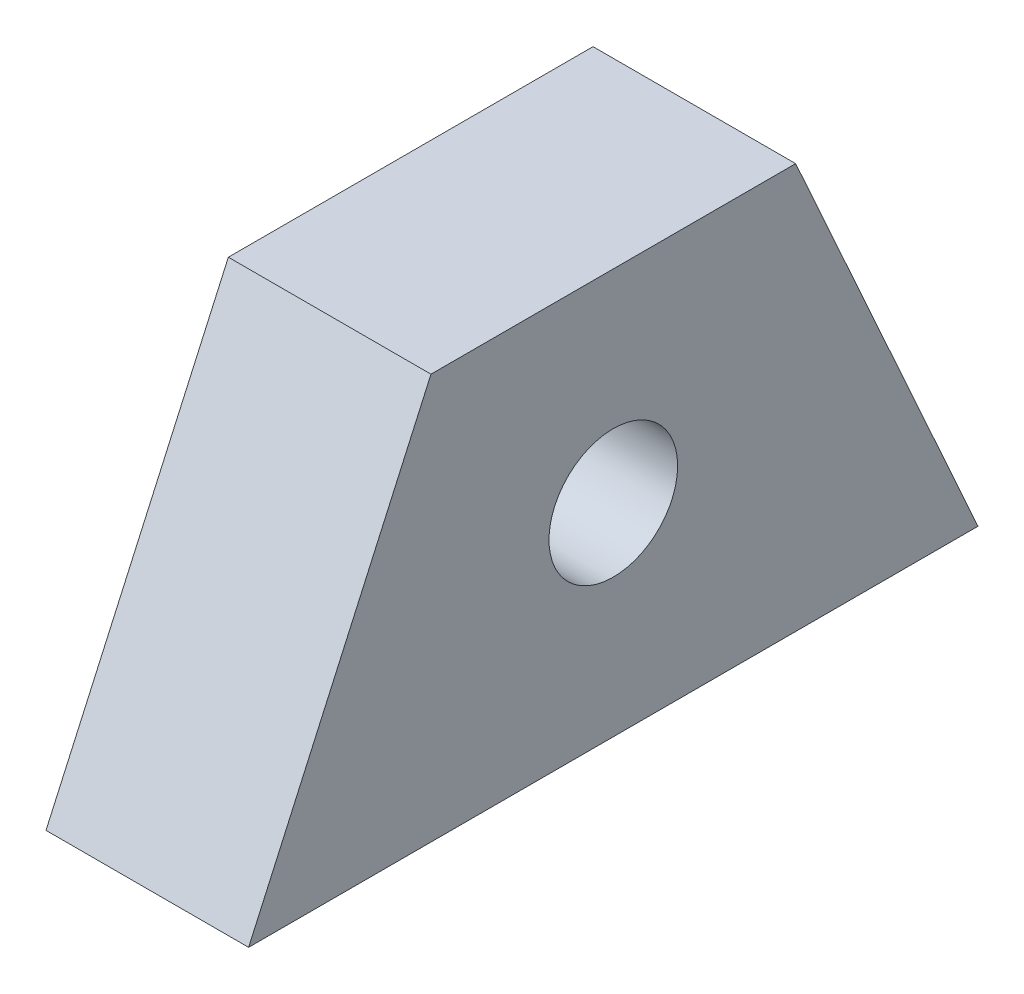
ISO-10303-21;
HEADER;
FILE_DESCRIPTION(('STEP AP214'),'2;1');
FILE_NAME('part.step','',(''),(''),'','','');
FILE_SCHEMA(('AUTOMOTIVE_DESIGN { 1 0 10303 214 1 1 1 1 }'));
ENDSEC;
DATA;
#1=APPLICATION_CONTEXT('core data for automotive mechanical design processes');
#2=APPLICATION_PROTOCOL_DEFINITION('international standard','automotive_design',2000,#1);
#3=PRODUCT_CONTEXT('',#1,'mechanical');
#4=PRODUCT('Part','Part','',(#3));
#5=PRODUCT_RELATED_PRODUCT_CATEGORY('part','',(#4));
#6=PRODUCT_DEFINITION_FORMATION('','',#4);
#7=PRODUCT_DEFINITION_CONTEXT('part definition',#1,'design');
#8=PRODUCT_DEFINITION('design','',#6,#7);
#9=PRODUCT_DEFINITION_SHAPE('','',#8);
#10=(LENGTH_UNIT() NAMED_UNIT(*) SI_UNIT(.MILLI.,.METRE.));
#11=(NAMED_UNIT(*) PLANE_ANGLE_UNIT() SI_UNIT($,.RADIAN.));
#12=(NAMED_UNIT(*) SI_UNIT($,.STERADIAN.) SOLID_ANGLE_UNIT());
#13=UNCERTAINTY_MEASURE_WITH_UNIT(LENGTH_MEASURE(1.E-05),#10,'distance_accuracy_value','');
#14=(GEOMETRIC_REPRESENTATION_CONTEXT(3) GLOBAL_UNCERTAINTY_ASSIGNED_CONTEXT((#13)) GLOBAL_UNIT_ASSIGNED_CONTEXT((#10,
#11,#12)) REPRESENTATION_CONTEXT('',''));
#15=CARTESIAN_POINT('',(0.,0.,0.));
#16=DIRECTION('',(0.,0.,1.));
#17=DIRECTION('',(1.,0.,0.));
#18=AXIS2_PLACEMENT_3D('',#15,#16,#17);
#19=CARTESIAN_POINT('',(10.,6.73596673596674,14.968814968815));
#20=DIRECTION('',(0.,0.410364677328798,0.911921505175106));
#21=DIRECTION('',(0.,-0.911921505175106,0.410364677328798));
#22=AXIS2_PLACEMENT_3D('',#19,#20,#21);
#23=PLANE('',#22);
#24=DIRECTION('',(0.,0.911921505175106,-0.410364677328798));
#25=VECTOR('',#24,1.);
#26=CARTESIAN_POINT('',(0.,6.73596673596674,14.968814968815));
#27=LINE('',#26,#25);
#28=CARTESIAN_POINT('',(0.,0.,18.));
#29=VERTEX_POINT('',#28);
#30=CARTESIAN_POINT('',(0.,20.,9.));
#31=VERTEX_POINT('',#30);
#32=EDGE_CURVE('E110',#29,#31,#27,.T.);
#33=ORIENTED_EDGE('',*,*,#32,.F.);
#34=DIRECTION('',(-1.,0.,0.));
#35=VECTOR('',#34,1.);
#36=CARTESIAN_POINT('',(10.,0.,18.));
#37=LINE('',#36,#35);
#38=CARTESIAN_POINT('',(10.,0.,18.));
#39=VERTEX_POINT('',#38);
#40=EDGE_CURVE('E11',#39,#29,#37,.T.);
#41=ORIENTED_EDGE('',*,*,#40,.F.);
#42=DIRECTION('',(0.,0.911921505175106,-0.410364677328798));
#43=VECTOR('',#42,1.);
#44=CARTESIAN_POINT('',(10.,6.73596673596674,14.968814968815));
#45=LINE('',#44,#43);
#46=CARTESIAN_POINT('',(10.,20.,9.));
#47=VERTEX_POINT('',#46);
#48=EDGE_CURVE('E95',#39,#47,#45,.T.);
#49=ORIENTED_EDGE('',*,*,#48,.T.);
#50=DIRECTION('',(-1.,0.,0.));
#51=VECTOR('',#50,1.);
#52=CARTESIAN_POINT('',(10.,20.,9.));
#53=LINE('',#52,#51);
#54=EDGE_CURVE('E83',#47,#31,#53,.T.);
#55=ORIENTED_EDGE('',*,*,#54,.T.);
#56=EDGE_LOOP('',(#33,#41,#49,#55));
#57=FACE_BOUND('',#56,.T.);
#58=ADVANCED_FACE('F44',(#57),#23,.T.);
#59=CARTESIAN_POINT('',(10.,0.,0.));
#60=DIRECTION('',(0.,1.,0.));
#61=DIRECTION('',(0.,0.,1.));
#62=AXIS2_PLACEMENT_3D('',#59,#60,#61);
#63=PLANE('',#62);
#64=DIRECTION('',(0.,0.,-1.));
#65=VECTOR('',#64,1.);
#66=CARTESIAN_POINT('',(0.,0.,0.));
#67=LINE('',#66,#65);
#68=CARTESIAN_POINT('',(0.,0.,-18.));
#69=VERTEX_POINT('',#68);
#70=EDGE_CURVE('E100',#29,#69,#67,.T.);
#71=ORIENTED_EDGE('',*,*,#70,.T.);
#72=DIRECTION('',(-1.,0.,0.));
#73=VECTOR('',#72,1.);
#74=CARTESIAN_POINT('',(10.,0.,-18.));
#75=LINE('',#74,#73);
#76=CARTESIAN_POINT('',(10.,0.,-18.));
#77=VERTEX_POINT('',#76);
#78=EDGE_CURVE('E52',#77,#69,#75,.T.);
#79=ORIENTED_EDGE('',*,*,#78,.F.);
#80=DIRECTION('',(0.,0.,-1.));
#81=VECTOR('',#80,1.);
#82=CARTESIAN_POINT('',(10.,0.,0.));
#83=LINE('',#82,#81);
#84=EDGE_CURVE('E89',#39,#77,#83,.T.);
#85=ORIENTED_EDGE('',*,*,#84,.F.);
#86=ORIENTED_EDGE('',*,*,#40,.T.);
#87=EDGE_LOOP('',(#71,#79,#85,#86));
#88=FACE_BOUND('',#87,.T.);
#89=ADVANCED_FACE('F98',(#88),#63,.F.);
#90=CARTESIAN_POINT('',(10.,6.73596673596674,-14.968814968815));
#91=DIRECTION('',(0.,-0.410364677328798,0.911921505175106));
#92=DIRECTION('',(0.,-0.911921505175106,-0.410364677328798));
#93=AXIS2_PLACEMENT_3D('',#90,#91,#92);
#94=PLANE('',#93);
#95=DIRECTION('',(0.,0.911921505175106,0.410364677328798));
#96=VECTOR('',#95,1.);
#97=CARTESIAN_POINT('',(0.,6.73596673596674,-14.968814968815));
#98=LINE('',#97,#96);
#99=CARTESIAN_POINT('',(0.,20.,-9.));
#100=VERTEX_POINT('',#99);
#101=EDGE_CURVE('E76',#69,#100,#98,.T.);
#102=ORIENTED_EDGE('',*,*,#101,.T.);
#103=DIRECTION('',(-1.,0.,0.));
#104=VECTOR('',#103,1.);
#105=CARTESIAN_POINT('',(10.,20.,-9.));
#106=LINE('',#105,#104);
#107=CARTESIAN_POINT('',(10.,20.,-9.));
#108=VERTEX_POINT('',#107);
#109=EDGE_CURVE('E101',#108,#100,#106,.T.);
#110=ORIENTED_EDGE('',*,*,#109,.F.);
#111=DIRECTION('',(0.,0.911921505175106,0.410364677328798));
#112=VECTOR('',#111,1.);
#113=CARTESIAN_POINT('',(10.,6.73596673596674,-14.968814968815));
#114=LINE('',#113,#112);
#115=EDGE_CURVE('E94',#77,#108,#114,.T.);
#116=ORIENTED_EDGE('',*,*,#115,.F.);
#117=ORIENTED_EDGE('',*,*,#78,.T.);
#118=EDGE_LOOP('',(#102,#110,#116,#117));
#119=FACE_BOUND('',#118,.T.);
#120=ADVANCED_FACE('F102',(#119),#94,.F.);
#121=CARTESIAN_POINT('',(10.,20.,0.));
#122=DIRECTION('',(0.,-1.,0.));
#123=DIRECTION('',(0.,0.,-1.));
#124=AXIS2_PLACEMENT_3D('',#121,#122,#123);
#125=PLANE('',#124);
#126=DIRECTION('',(0.,0.,1.));
#127=VECTOR('',#126,1.);
#128=CARTESIAN_POINT('',(0.,20.,0.));
#129=LINE('',#128,#127);
#130=EDGE_CURVE('E115',#100,#31,#129,.T.);
#131=ORIENTED_EDGE('',*,*,#130,.T.);
#132=ORIENTED_EDGE('',*,*,#54,.F.);
#133=DIRECTION('',(0.,0.,1.));
#134=VECTOR('',#133,1.);
#135=CARTESIAN_POINT('',(10.,20.,0.));
#136=LINE('',#135,#134);
#137=EDGE_CURVE('E60',#108,#47,#136,.T.);
#138=ORIENTED_EDGE('',*,*,#137,.F.);
#139=ORIENTED_EDGE('',*,*,#109,.T.);
#140=EDGE_LOOP('',(#131,#132,#138,#139));
#141=FACE_BOUND('',#140,.T.);
#142=ADVANCED_FACE('F123',(#141),#125,.F.);
#143=CARTESIAN_POINT('',(10.,10.,0.));
#144=DIRECTION('',(-1.,0.,0.));
#145=DIRECTION('',(0.,0.,1.));
#146=AXIS2_PLACEMENT_3D('',#143,#144,#145);
#147=CYLINDRICAL_SURFACE('',#146,3.175);
#148=CARTESIAN_POINT('',(10.,10.,0.));
#149=DIRECTION('',(1.,0.,0.));
#150=DIRECTION('',(0.,0.,-1.));
#151=AXIS2_PLACEMENT_3D('',#148,#149,#150);
#152=CIRCLE('',#151,3.175);
#153=CARTESIAN_POINT('',(10.,10.,-3.175));
#154=VERTEX_POINT('',#153);
#155=EDGE_CURVE('E104',#154,#154,#152,.T.);
#156=ORIENTED_EDGE('',*,*,#155,.T.);
#157=EDGE_LOOP('',(#156));
#158=FACE_BOUND('',#157,.T.);
#159=CARTESIAN_POINT('',(0.,10.,0.));
#160=DIRECTION('',(1.,0.,0.));
#161=DIRECTION('',(0.,0.,-1.));
#162=AXIS2_PLACEMENT_3D('',#159,#160,#161);
#163=CIRCLE('',#162,3.175);
#164=CARTESIAN_POINT('',(0.,10.,-3.175));
#165=VERTEX_POINT('',#164);
#166=EDGE_CURVE('E117',#165,#165,#163,.T.);
#167=ORIENTED_EDGE('',*,*,#166,.F.);
#168=EDGE_LOOP('',(#167));
#169=FACE_BOUND('',#168,.T.);
#170=ADVANCED_FACE('F138',(#158,#169),#147,.F.);
#171=CARTESIAN_POINT('',(10.,0.,0.));
#172=DIRECTION('',(1.,0.,0.));
#173=DIRECTION('',(0.,0.,-1.));
#174=AXIS2_PLACEMENT_3D('',#171,#172,#173);
#175=PLANE('',#174);
#176=ORIENTED_EDGE('',*,*,#48,.F.);
#177=ORIENTED_EDGE('',*,*,#84,.T.);
#178=ORIENTED_EDGE('',*,*,#115,.T.);
#179=ORIENTED_EDGE('',*,*,#137,.T.);
#180=EDGE_LOOP('',(#176,#177,#178,#179));
#181=FACE_BOUND('',#180,.T.);
#182=ORIENTED_EDGE('',*,*,#155,.F.);
#183=EDGE_LOOP('',(#182));
#184=FACE_BOUND('',#183,.T.);
#185=ADVANCED_FACE('F91',(#181,#184),#175,.T.);
#186=CARTESIAN_POINT('',(0.,0.,0.));
#187=DIRECTION('',(1.,0.,0.));
#188=DIRECTION('',(0.,0.,-1.));
#189=AXIS2_PLACEMENT_3D('',#186,#187,#188);
#190=PLANE('',#189);
#191=ORIENTED_EDGE('',*,*,#32,.T.);
#192=ORIENTED_EDGE('',*,*,#130,.F.);
#193=ORIENTED_EDGE('',*,*,#101,.F.);
#194=ORIENTED_EDGE('',*,*,#70,.F.);
#195=EDGE_LOOP('',(#191,#192,#193,#194));
#196=FACE_BOUND('',#195,.T.);
#197=ORIENTED_EDGE('',*,*,#166,.T.);
#198=EDGE_LOOP('',(#197));
#199=FACE_BOUND('',#198,.T.);
#200=ADVANCED_FACE('F125',(#196,#199),#190,.F.);
#201=CLOSED_SHELL('',(#58,#89,#120,#142,#170,#185,#200));
#202=MANIFOLD_SOLID_BREP('B2',#201);
#203=ADVANCED_BREP_SHAPE_REPRESENTATION('',(#18,#202),#14);
#204=SHAPE_DEFINITION_REPRESENTATION(#9,#203);
ENDSEC;
END-ISO-10303-21;
